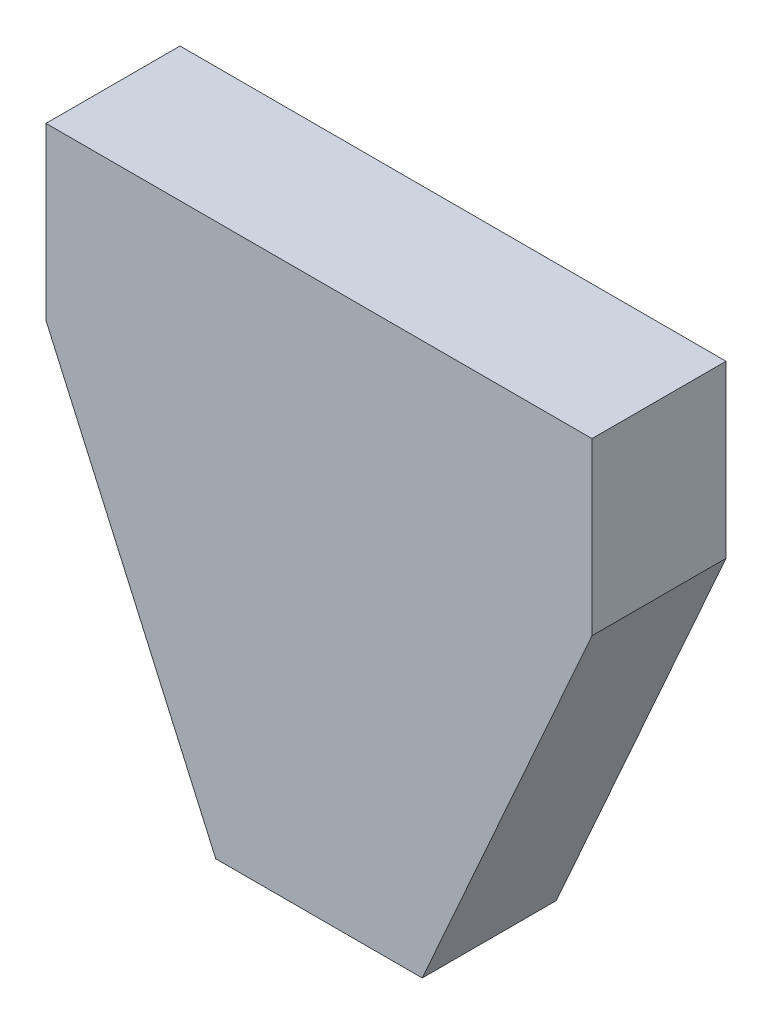
ISO-10303-21;
HEADER;
FILE_DESCRIPTION(('STEP AP214'),'2;1');
FILE_NAME('part.step','',(''),(''),'','','');
FILE_SCHEMA(('AUTOMOTIVE_DESIGN { 1 0 10303 214 1 1 1 1 }'));
ENDSEC;
DATA;
#1=APPLICATION_CONTEXT('core data for automotive mechanical design processes');
#2=APPLICATION_PROTOCOL_DEFINITION('international standard','automotive_design',2000,#1);
#3=PRODUCT_CONTEXT('',#1,'mechanical');
#4=PRODUCT('Part','Part','',(#3));
#5=PRODUCT_RELATED_PRODUCT_CATEGORY('part','',(#4));
#6=PRODUCT_DEFINITION_FORMATION('','',#4);
#7=PRODUCT_DEFINITION_CONTEXT('part definition',#1,'design');
#8=PRODUCT_DEFINITION('design','',#6,#7);
#9=PRODUCT_DEFINITION_SHAPE('','',#8);
#10=(LENGTH_UNIT() NAMED_UNIT(*) SI_UNIT(.MILLI.,.METRE.));
#11=(NAMED_UNIT(*) PLANE_ANGLE_UNIT() SI_UNIT($,.RADIAN.));
#12=(NAMED_UNIT(*) SI_UNIT($,.STERADIAN.) SOLID_ANGLE_UNIT());
#13=UNCERTAINTY_MEASURE_WITH_UNIT(LENGTH_MEASURE(1.E-05),#10,'distance_accuracy_value','');
#14=(GEOMETRIC_REPRESENTATION_CONTEXT(3) GLOBAL_UNCERTAINTY_ASSIGNED_CONTEXT((#13)) GLOBAL_UNIT_ASSIGNED_CONTEXT((#10,
#11,#12)) REPRESENTATION_CONTEXT('',''));
#15=CARTESIAN_POINT('',(0.,0.,0.));
#16=DIRECTION('',(0.,0.,1.));
#17=DIRECTION('',(1.,0.,0.));
#18=AXIS2_PLACEMENT_3D('',#15,#16,#17);
#19=CARTESIAN_POINT('',(-550.,500.,135.));
#20=DIRECTION('',(1.,0.,0.));
#21=DIRECTION('',(0.,1.,0.));
#22=AXIS2_PLACEMENT_3D('',#19,#20,#21);
#23=PLANE('',#22);
#24=DIRECTION('',(0.,-1.,0.));
#25=VECTOR('',#24,1.);
#26=CARTESIAN_POINT('',(-550.,500.,-135.));
#27=LINE('',#26,#25);
#28=CARTESIAN_POINT('',(-550.,500.,-135.));
#29=VERTEX_POINT('',#28);
#30=CARTESIAN_POINT('',(-550.,156.,-135.));
#31=VERTEX_POINT('',#30);
#32=EDGE_CURVE('E129',#29,#31,#27,.T.);
#33=ORIENTED_EDGE('',*,*,#32,.T.);
#34=DIRECTION('',(0.,0.,-1.));
#35=VECTOR('',#34,1.);
#36=CARTESIAN_POINT('',(-550.,156.,135.));
#37=LINE('',#36,#35);
#38=CARTESIAN_POINT('',(-550.,156.,135.));
#39=VERTEX_POINT('',#38);
#40=EDGE_CURVE('E11',#39,#31,#37,.T.);
#41=ORIENTED_EDGE('',*,*,#40,.F.);
#42=DIRECTION('',(0.,-1.,0.));
#43=VECTOR('',#42,1.);
#44=CARTESIAN_POINT('',(-550.,500.,135.));
#45=LINE('',#44,#43);
#46=CARTESIAN_POINT('',(-550.,500.,135.));
#47=VERTEX_POINT('',#46);
#48=EDGE_CURVE('E141',#47,#39,#45,.T.);
#49=ORIENTED_EDGE('',*,*,#48,.F.);
#50=DIRECTION('',(0.,0.,-1.));
#51=VECTOR('',#50,1.);
#52=CARTESIAN_POINT('',(-550.,500.,135.));
#53=LINE('',#52,#51);
#54=EDGE_CURVE('E125',#47,#29,#53,.T.);
#55=ORIENTED_EDGE('',*,*,#54,.T.);
#56=EDGE_LOOP('',(#33,#41,#49,#55));
#57=FACE_BOUND('',#56,.T.);
#58=ADVANCED_FACE('F33',(#57),#23,.F.);
#59=CARTESIAN_POINT('',(-550.,156.,135.));
#60=DIRECTION('',(0.913545457642602,0.406736643075798,0.));
#61=DIRECTION('',(-0.406736643075798,0.913545457642602,0.));
#62=AXIS2_PLACEMENT_3D('',#59,#60,#61);
#63=PLANE('',#62);
#64=DIRECTION('',(0.406736643075798,-0.913545457642602,0.));
#65=VECTOR('',#64,1.);
#66=CARTESIAN_POINT('',(-550.,156.,-135.));
#67=LINE('',#66,#65);
#68=CARTESIAN_POINT('',(-208.,-612.144576675248,-135.));
#69=VERTEX_POINT('',#68);
#70=EDGE_CURVE('E132',#31,#69,#67,.T.);
#71=ORIENTED_EDGE('',*,*,#70,.T.);
#72=DIRECTION('',(0.,0.,-1.));
#73=VECTOR('',#72,1.);
#74=CARTESIAN_POINT('',(-208.,-612.144576675248,135.));
#75=LINE('',#74,#73);
#76=CARTESIAN_POINT('',(-208.,-612.144576675248,135.));
#77=VERTEX_POINT('',#76);
#78=EDGE_CURVE('E40',#77,#69,#75,.T.);
#79=ORIENTED_EDGE('',*,*,#78,.F.);
#80=DIRECTION('',(0.406736643075798,-0.913545457642602,0.));
#81=VECTOR('',#80,1.);
#82=CARTESIAN_POINT('',(-550.,156.,135.));
#83=LINE('',#82,#81);
#84=EDGE_CURVE('E91',#39,#77,#83,.T.);
#85=ORIENTED_EDGE('',*,*,#84,.F.);
#86=ORIENTED_EDGE('',*,*,#40,.T.);
#87=EDGE_LOOP('',(#71,#79,#85,#86));
#88=FACE_BOUND('',#87,.T.);
#89=ADVANCED_FACE('F254',(#88),#63,.F.);
#90=CARTESIAN_POINT('',(-208.,-612.144576675248,135.));
#91=DIRECTION('',(0.,1.,0.));
#92=DIRECTION('',(0.,0.,1.));
#93=AXIS2_PLACEMENT_3D('',#90,#91,#92);
#94=PLANE('',#93);
#95=DIRECTION('',(1.,0.,0.));
#96=VECTOR('',#95,1.);
#97=CARTESIAN_POINT('',(-208.,-612.144576675248,-135.));
#98=LINE('',#97,#96);
#99=CARTESIAN_POINT('',(208.,-612.144576675248,-135.));
#100=VERTEX_POINT('',#99);
#101=EDGE_CURVE('E135',#69,#100,#98,.T.);
#102=ORIENTED_EDGE('',*,*,#101,.T.);
#103=DIRECTION('',(0.,0.,-1.));
#104=VECTOR('',#103,1.);
#105=CARTESIAN_POINT('',(208.,-612.144576675248,135.));
#106=LINE('',#105,#104);
#107=CARTESIAN_POINT('',(208.,-612.144576675248,135.));
#108=VERTEX_POINT('',#107);
#109=EDGE_CURVE('E120',#108,#100,#106,.T.);
#110=ORIENTED_EDGE('',*,*,#109,.F.);
#111=DIRECTION('',(1.,0.,0.));
#112=VECTOR('',#111,1.);
#113=CARTESIAN_POINT('',(-208.,-612.144576675248,135.));
#114=LINE('',#113,#112);
#115=EDGE_CURVE('E108',#77,#108,#114,.T.);
#116=ORIENTED_EDGE('',*,*,#115,.F.);
#117=ORIENTED_EDGE('',*,*,#78,.T.);
#118=EDGE_LOOP('',(#102,#110,#116,#117));
#119=FACE_BOUND('',#118,.T.);
#120=ADVANCED_FACE('F147',(#119),#94,.F.);
#121=CARTESIAN_POINT('',(550.,156.,135.));
#122=DIRECTION('',(-0.913545457642602,0.406736643075797,0.));
#123=DIRECTION('',(-0.406736643075797,-0.913545457642602,0.));
#124=AXIS2_PLACEMENT_3D('',#121,#122,#123);
#125=PLANE('',#124);
#126=DIRECTION('',(0.406736643075797,0.913545457642602,0.));
#127=VECTOR('',#126,1.);
#128=CARTESIAN_POINT('',(550.,156.,-135.));
#129=LINE('',#128,#127);
#130=CARTESIAN_POINT('',(550.,156.,-135.));
#131=VERTEX_POINT('',#130);
#132=EDGE_CURVE('E117',#100,#131,#129,.T.);
#133=ORIENTED_EDGE('',*,*,#132,.T.);
#134=DIRECTION('',(0.,0.,-1.));
#135=VECTOR('',#134,1.);
#136=CARTESIAN_POINT('',(550.,156.,135.));
#137=LINE('',#136,#135);
#138=CARTESIAN_POINT('',(550.,156.,135.));
#139=VERTEX_POINT('',#138);
#140=EDGE_CURVE('E114',#139,#131,#137,.T.);
#141=ORIENTED_EDGE('',*,*,#140,.F.);
#142=DIRECTION('',(0.406736643075797,0.913545457642602,0.));
#143=VECTOR('',#142,1.);
#144=CARTESIAN_POINT('',(550.,156.,135.));
#145=LINE('',#144,#143);
#146=EDGE_CURVE('E101',#108,#139,#145,.T.);
#147=ORIENTED_EDGE('',*,*,#146,.F.);
#148=ORIENTED_EDGE('',*,*,#109,.T.);
#149=EDGE_LOOP('',(#133,#141,#147,#148));
#150=FACE_BOUND('',#149,.T.);
#151=ADVANCED_FACE('F115',(#150),#125,.F.);
#152=CARTESIAN_POINT('',(550.,500.,135.));
#153=DIRECTION('',(-1.,0.,0.));
#154=DIRECTION('',(0.,-1.,0.));
#155=AXIS2_PLACEMENT_3D('',#152,#153,#154);
#156=PLANE('',#155);
#157=DIRECTION('',(0.,1.,0.));
#158=VECTOR('',#157,1.);
#159=CARTESIAN_POINT('',(550.,500.,-135.));
#160=LINE('',#159,#158);
#161=CARTESIAN_POINT('',(550.,500.,-135.));
#162=VERTEX_POINT('',#161);
#163=EDGE_CURVE('E138',#131,#162,#160,.T.);
#164=ORIENTED_EDGE('',*,*,#163,.T.);
#165=DIRECTION('',(0.,0.,-1.));
#166=VECTOR('',#165,1.);
#167=CARTESIAN_POINT('',(550.,500.,135.));
#168=LINE('',#167,#166);
#169=CARTESIAN_POINT('',(550.,500.,135.));
#170=VERTEX_POINT('',#169);
#171=EDGE_CURVE('E121',#170,#162,#168,.T.);
#172=ORIENTED_EDGE('',*,*,#171,.F.);
#173=DIRECTION('',(0.,1.,0.));
#174=VECTOR('',#173,1.);
#175=CARTESIAN_POINT('',(550.,500.,135.));
#176=LINE('',#175,#174);
#177=EDGE_CURVE('E105',#139,#170,#176,.T.);
#178=ORIENTED_EDGE('',*,*,#177,.F.);
#179=ORIENTED_EDGE('',*,*,#140,.T.);
#180=EDGE_LOOP('',(#164,#172,#178,#179));
#181=FACE_BOUND('',#180,.T.);
#182=ADVANCED_FACE('F123',(#181),#156,.F.);
#183=CARTESIAN_POINT('',(550.,500.,135.));
#184=DIRECTION('',(0.,-1.,0.));
#185=DIRECTION('',(1.,0.,0.));
#186=AXIS2_PLACEMENT_3D('',#183,#184,#185);
#187=PLANE('',#186);
#188=DIRECTION('',(-1.,0.,0.));
#189=VECTOR('',#188,1.);
#190=CARTESIAN_POINT('',(550.,500.,-135.));
#191=LINE('',#190,#189);
#192=EDGE_CURVE('E83',#162,#29,#191,.T.);
#193=ORIENTED_EDGE('',*,*,#192,.T.);
#194=ORIENTED_EDGE('',*,*,#54,.F.);
#195=DIRECTION('',(-1.,0.,0.));
#196=VECTOR('',#195,1.);
#197=CARTESIAN_POINT('',(550.,500.,135.));
#198=LINE('',#197,#196);
#199=EDGE_CURVE('E56',#170,#47,#198,.T.);
#200=ORIENTED_EDGE('',*,*,#199,.F.);
#201=ORIENTED_EDGE('',*,*,#171,.T.);
#202=EDGE_LOOP('',(#193,#194,#200,#201));
#203=FACE_BOUND('',#202,.T.);
#204=ADVANCED_FACE('F151',(#203),#187,.F.);
#205=CARTESIAN_POINT('',(0.,0.,135.));
#206=DIRECTION('',(0.,0.,1.));
#207=DIRECTION('',(1.,0.,0.));
#208=AXIS2_PLACEMENT_3D('',#205,#206,#207);
#209=PLANE('',#208);
#210=ORIENTED_EDGE('',*,*,#48,.T.);
#211=ORIENTED_EDGE('',*,*,#84,.T.);
#212=ORIENTED_EDGE('',*,*,#115,.T.);
#213=ORIENTED_EDGE('',*,*,#146,.T.);
#214=ORIENTED_EDGE('',*,*,#177,.T.);
#215=ORIENTED_EDGE('',*,*,#199,.T.);
#216=EDGE_LOOP('',(#210,#211,#212,#213,#214,#215));
#217=FACE_BOUND('',#216,.T.);
#218=ADVANCED_FACE('F103',(#217),#209,.T.);
#219=CARTESIAN_POINT('',(0.,0.,-135.));
#220=DIRECTION('',(0.,0.,1.));
#221=DIRECTION('',(1.,0.,0.));
#222=AXIS2_PLACEMENT_3D('',#219,#220,#221);
#223=PLANE('',#222);
#224=DIRECTION('',(-1.,0.,0.));
#225=VECTOR('',#224,1.);
#226=CARTESIAN_POINT('',(550.,498.,-135.));
#227=LINE('',#226,#225);
#228=CARTESIAN_POINT('',(548.,498.,-135.));
#229=VERTEX_POINT('',#228);
#230=CARTESIAN_POINT('',(-548.,498.,-135.));
#231=VERTEX_POINT('',#230);
#232=EDGE_CURVE('E169',#229,#231,#227,.T.);
#233=ORIENTED_EDGE('',*,*,#232,.T.);
#234=DIRECTION('',(0.,-1.,0.));
#235=VECTOR('',#234,1.);
#236=CARTESIAN_POINT('',(-548.,500.,-135.));
#237=LINE('',#236,#235);
#238=CARTESIAN_POINT('',(-548.,156.42511312334,-135.));
#239=VERTEX_POINT('',#238);
#240=EDGE_CURVE('E161',#231,#239,#237,.T.);
#241=ORIENTED_EDGE('',*,*,#240,.T.);
#242=DIRECTION('',(0.406736643075798,-0.913545457642602,0.));
#243=VECTOR('',#242,1.);
#244=CARTESIAN_POINT('',(-548.172909084715,156.813473286152,-135.));
#245=LINE('',#244,#243);
#246=CARTESIAN_POINT('',(-206.701184813605,-610.144576675248,-135.));
#247=VERTEX_POINT('',#246);
#248=EDGE_CURVE('E158',#239,#247,#245,.T.);
#249=ORIENTED_EDGE('',*,*,#248,.T.);
#250=DIRECTION('',(1.,0.,0.));
#251=VECTOR('',#250,1.);
#252=CARTESIAN_POINT('',(-208.,-610.144576675248,-135.));
#253=LINE('',#252,#251);
#254=CARTESIAN_POINT('',(206.701184813605,-610.144576675248,-135.));
#255=VERTEX_POINT('',#254);
#256=EDGE_CURVE('E47',#247,#255,#253,.T.);
#257=ORIENTED_EDGE('',*,*,#256,.T.);
#258=DIRECTION('',(0.406736643075797,0.913545457642602,0.));
#259=VECTOR('',#258,1.);
#260=CARTESIAN_POINT('',(548.172909084715,156.813473286152,-135.));
#261=LINE('',#260,#259);
#262=CARTESIAN_POINT('',(548.,156.42511312334,-135.));
#263=VERTEX_POINT('',#262);
#264=EDGE_CURVE('E163',#255,#263,#261,.T.);
#265=ORIENTED_EDGE('',*,*,#264,.T.);
#266=DIRECTION('',(0.,1.,0.));
#267=VECTOR('',#266,1.);
#268=CARTESIAN_POINT('',(548.,500.,-135.));
#269=LINE('',#268,#267);
#270=EDGE_CURVE('E166',#263,#229,#269,.T.);
#271=ORIENTED_EDGE('',*,*,#270,.T.);
#272=EDGE_LOOP('',(#233,#241,#249,#257,#265,#271));
#273=FACE_BOUND('',#272,.T.);
#274=ORIENTED_EDGE('',*,*,#32,.F.);
#275=ORIENTED_EDGE('',*,*,#192,.F.);
#276=ORIENTED_EDGE('',*,*,#163,.F.);
#277=ORIENTED_EDGE('',*,*,#132,.F.);
#278=ORIENTED_EDGE('',*,*,#101,.F.);
#279=ORIENTED_EDGE('',*,*,#70,.F.);
#280=EDGE_LOOP('',(#274,#275,#276,#277,#278,#279));
#281=FACE_BOUND('',#280,.T.);
#282=ADVANCED_FACE('F150',(#273,#281),#223,.F.);
#283=CARTESIAN_POINT('',(-548.,500.,135.));
#284=DIRECTION('',(1.,0.,0.));
#285=DIRECTION('',(0.,1.,0.));
#286=AXIS2_PLACEMENT_3D('',#283,#284,#285);
#287=PLANE('',#286);
#288=ORIENTED_EDGE('',*,*,#240,.F.);
#289=DIRECTION('',(0.,0.,-1.));
#290=VECTOR('',#289,1.);
#291=CARTESIAN_POINT('',(-548.,498.,135.));
#292=LINE('',#291,#290);
#293=CARTESIAN_POINT('',(-548.,498.,133.));
#294=VERTEX_POINT('',#293);
#295=EDGE_CURVE('E178',#294,#231,#292,.T.);
#296=ORIENTED_EDGE('',*,*,#295,.F.);
#297=DIRECTION('',(0.,-1.,0.));
#298=VECTOR('',#297,1.);
#299=CARTESIAN_POINT('',(-548.,500.,133.));
#300=LINE('',#299,#298);
#301=CARTESIAN_POINT('',(-548.,156.42511312334,133.));
#302=VERTEX_POINT('',#301);
#303=EDGE_CURVE('E172',#294,#302,#300,.T.);
#304=ORIENTED_EDGE('',*,*,#303,.T.);
#305=DIRECTION('',(0.,0.,-1.));
#306=VECTOR('',#305,1.);
#307=CARTESIAN_POINT('',(-548.,156.42511312334,135.));
#308=LINE('',#307,#306);
#309=EDGE_CURVE('E133',#302,#239,#308,.T.);
#310=ORIENTED_EDGE('',*,*,#309,.T.);
#311=EDGE_LOOP('',(#288,#296,#304,#310));
#312=FACE_BOUND('',#311,.T.);
#313=ADVANCED_FACE('F209',(#312),#287,.T.);
#314=CARTESIAN_POINT('',(-548.172909084715,156.813473286152,135.));
#315=DIRECTION('',(0.913545457642602,0.406736643075798,0.));
#316=DIRECTION('',(-0.406736643075798,0.913545457642602,0.));
#317=AXIS2_PLACEMENT_3D('',#314,#315,#316);
#318=PLANE('',#317);
#319=ORIENTED_EDGE('',*,*,#248,.F.);
#320=ORIENTED_EDGE('',*,*,#309,.F.);
#321=DIRECTION('',(0.406736643075798,-0.913545457642602,0.));
#322=VECTOR('',#321,1.);
#323=CARTESIAN_POINT('',(-548.172909084715,156.813473286152,133.));
#324=LINE('',#323,#322);
#325=CARTESIAN_POINT('',(-206.701184813605,-610.144576675248,133.));
#326=VERTEX_POINT('',#325);
#327=EDGE_CURVE('E195',#302,#326,#324,.T.);
#328=ORIENTED_EDGE('',*,*,#327,.T.);
#329=DIRECTION('',(0.,0.,-1.));
#330=VECTOR('',#329,1.);
#331=CARTESIAN_POINT('',(-206.701184813605,-610.144576675248,135.));
#332=LINE('',#331,#330);
#333=EDGE_CURVE('E197',#326,#247,#332,.T.);
#334=ORIENTED_EDGE('',*,*,#333,.T.);
#335=EDGE_LOOP('',(#319,#320,#328,#334));
#336=FACE_BOUND('',#335,.T.);
#337=ADVANCED_FACE('F284',(#336),#318,.T.);
#338=CARTESIAN_POINT('',(-208.,-610.144576675248,135.));
#339=DIRECTION('',(0.,1.,0.));
#340=DIRECTION('',(0.,0.,1.));
#341=AXIS2_PLACEMENT_3D('',#338,#339,#340);
#342=PLANE('',#341);
#343=ORIENTED_EDGE('',*,*,#256,.F.);
#344=ORIENTED_EDGE('',*,*,#333,.F.);
#345=DIRECTION('',(1.,0.,0.));
#346=VECTOR('',#345,1.);
#347=CARTESIAN_POINT('',(-208.,-610.144576675248,133.));
#348=LINE('',#347,#346);
#349=CARTESIAN_POINT('',(206.701184813605,-610.144576675248,133.));
#350=VERTEX_POINT('',#349);
#351=EDGE_CURVE('E189',#326,#350,#348,.T.);
#352=ORIENTED_EDGE('',*,*,#351,.T.);
#353=DIRECTION('',(0.,0.,-1.));
#354=VECTOR('',#353,1.);
#355=CARTESIAN_POINT('',(206.701184813605,-610.144576675248,135.));
#356=LINE('',#355,#354);
#357=EDGE_CURVE('E192',#350,#255,#356,.T.);
#358=ORIENTED_EDGE('',*,*,#357,.T.);
#359=EDGE_LOOP('',(#343,#344,#352,#358));
#360=FACE_BOUND('',#359,.T.);
#361=ADVANCED_FACE('F234',(#360),#342,.T.);
#362=CARTESIAN_POINT('',(548.172909084715,156.813473286152,135.));
#363=DIRECTION('',(-0.913545457642602,0.406736643075797,0.));
#364=DIRECTION('',(-0.406736643075797,-0.913545457642602,0.));
#365=AXIS2_PLACEMENT_3D('',#362,#363,#364);
#366=PLANE('',#365);
#367=ORIENTED_EDGE('',*,*,#264,.F.);
#368=ORIENTED_EDGE('',*,*,#357,.F.);
#369=DIRECTION('',(0.406736643075797,0.913545457642602,0.));
#370=VECTOR('',#369,1.);
#371=CARTESIAN_POINT('',(548.172909084715,156.813473286152,133.));
#372=LINE('',#371,#370);
#373=CARTESIAN_POINT('',(548.,156.42511312334,133.));
#374=VERTEX_POINT('',#373);
#375=EDGE_CURVE('E182',#350,#374,#372,.T.);
#376=ORIENTED_EDGE('',*,*,#375,.T.);
#377=DIRECTION('',(0.,0.,-1.));
#378=VECTOR('',#377,1.);
#379=CARTESIAN_POINT('',(548.,156.42511312334,135.));
#380=LINE('',#379,#378);
#381=EDGE_CURVE('E186',#374,#263,#380,.T.);
#382=ORIENTED_EDGE('',*,*,#381,.T.);
#383=EDGE_LOOP('',(#367,#368,#376,#382));
#384=FACE_BOUND('',#383,.T.);
#385=ADVANCED_FACE('F239',(#384),#366,.T.);
#386=CARTESIAN_POINT('',(548.,500.,135.));
#387=DIRECTION('',(-1.,0.,0.));
#388=DIRECTION('',(0.,-1.,0.));
#389=AXIS2_PLACEMENT_3D('',#386,#387,#388);
#390=PLANE('',#389);
#391=ORIENTED_EDGE('',*,*,#270,.F.);
#392=ORIENTED_EDGE('',*,*,#381,.F.);
#393=DIRECTION('',(0.,1.,0.));
#394=VECTOR('',#393,1.);
#395=CARTESIAN_POINT('',(548.,500.,133.));
#396=LINE('',#395,#394);
#397=CARTESIAN_POINT('',(548.,498.,133.));
#398=VERTEX_POINT('',#397);
#399=EDGE_CURVE('E179',#374,#398,#396,.T.);
#400=ORIENTED_EDGE('',*,*,#399,.T.);
#401=DIRECTION('',(0.,0.,-1.));
#402=VECTOR('',#401,1.);
#403=CARTESIAN_POINT('',(548.,498.,135.));
#404=LINE('',#403,#402);
#405=EDGE_CURVE('E183',#398,#229,#404,.T.);
#406=ORIENTED_EDGE('',*,*,#405,.T.);
#407=EDGE_LOOP('',(#391,#392,#400,#406));
#408=FACE_BOUND('',#407,.T.);
#409=ADVANCED_FACE('F243',(#408),#390,.T.);
#410=CARTESIAN_POINT('',(550.,498.,135.));
#411=DIRECTION('',(0.,-1.,0.));
#412=DIRECTION('',(1.,0.,0.));
#413=AXIS2_PLACEMENT_3D('',#410,#411,#412);
#414=PLANE('',#413);
#415=ORIENTED_EDGE('',*,*,#232,.F.);
#416=ORIENTED_EDGE('',*,*,#405,.F.);
#417=DIRECTION('',(-1.,0.,0.));
#418=VECTOR('',#417,1.);
#419=CARTESIAN_POINT('',(550.,498.,133.));
#420=LINE('',#419,#418);
#421=EDGE_CURVE('E175',#398,#294,#420,.T.);
#422=ORIENTED_EDGE('',*,*,#421,.T.);
#423=ORIENTED_EDGE('',*,*,#295,.T.);
#424=EDGE_LOOP('',(#415,#416,#422,#423));
#425=FACE_BOUND('',#424,.T.);
#426=ADVANCED_FACE('F224',(#425),#414,.T.);
#427=CARTESIAN_POINT('',(0.,0.,133.));
#428=DIRECTION('',(0.,0.,1.));
#429=DIRECTION('',(1.,0.,0.));
#430=AXIS2_PLACEMENT_3D('',#427,#428,#429);
#431=PLANE('',#430);
#432=ORIENTED_EDGE('',*,*,#303,.F.);
#433=ORIENTED_EDGE('',*,*,#421,.F.);
#434=ORIENTED_EDGE('',*,*,#399,.F.);
#435=ORIENTED_EDGE('',*,*,#375,.F.);
#436=ORIENTED_EDGE('',*,*,#351,.F.);
#437=ORIENTED_EDGE('',*,*,#327,.F.);
#438=EDGE_LOOP('',(#432,#433,#434,#435,#436,#437));
#439=FACE_BOUND('',#438,.T.);
#440=ADVANCED_FACE('F250',(#439),#431,.F.);
#441=CLOSED_SHELL('',(#58,#89,#120,#151,#182,#204,#218,#282,#313,#337,#361,#385,#409,#426,#440));
#442=MANIFOLD_SOLID_BREP('B2',#441);
#443=ADVANCED_BREP_SHAPE_REPRESENTATION('',(#18,#442),#14);
#444=SHAPE_DEFINITION_REPRESENTATION(#9,#443);
ENDSEC;
END-ISO-10303-21;
